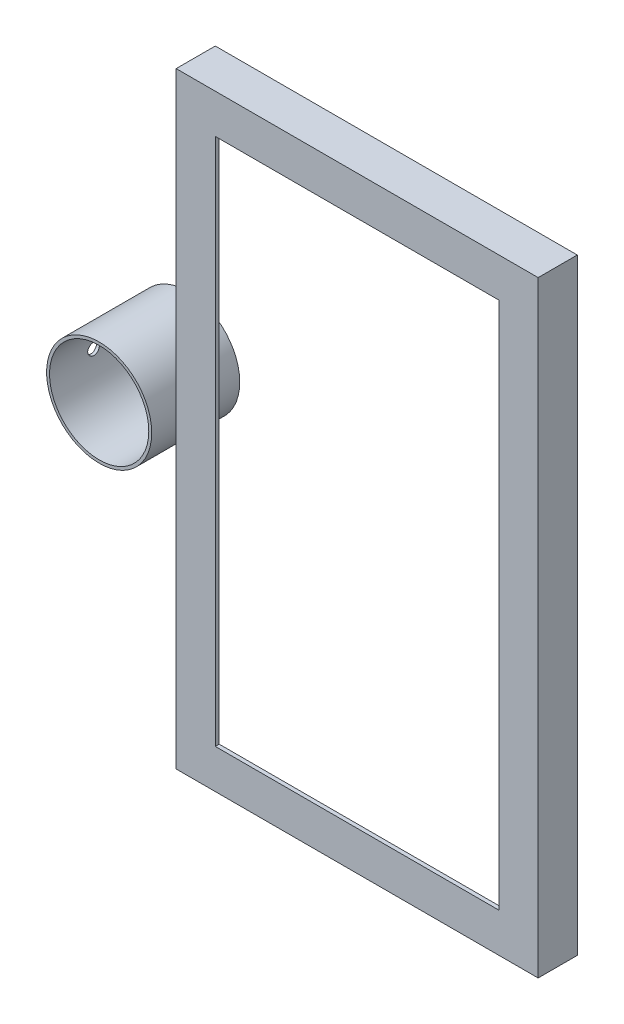
ISO-10303-21;
HEADER;
FILE_DESCRIPTION(('STEP AP214'),'2;1');
FILE_NAME('part.step','',(''),(''),'','','');
FILE_SCHEMA(('AUTOMOTIVE_DESIGN { 1 0 10303 214 1 1 1 1 }'));
ENDSEC;
DATA;
#1=APPLICATION_CONTEXT('core data for automotive mechanical design processes');
#2=APPLICATION_PROTOCOL_DEFINITION('international standard','automotive_design',2000,#1);
#3=PRODUCT_CONTEXT('',#1,'mechanical');
#4=PRODUCT('Part','Part','',(#3));
#5=PRODUCT_RELATED_PRODUCT_CATEGORY('part','',(#4));
#6=PRODUCT_DEFINITION_FORMATION('','',#4);
#7=PRODUCT_DEFINITION_CONTEXT('part definition',#1,'design');
#8=PRODUCT_DEFINITION('design','',#6,#7);
#9=PRODUCT_DEFINITION_SHAPE('','',#8);
#10=(LENGTH_UNIT() NAMED_UNIT(*) SI_UNIT(.MILLI.,.METRE.));
#11=(NAMED_UNIT(*) PLANE_ANGLE_UNIT() SI_UNIT($,.RADIAN.));
#12=(NAMED_UNIT(*) SI_UNIT($,.STERADIAN.) SOLID_ANGLE_UNIT());
#13=UNCERTAINTY_MEASURE_WITH_UNIT(LENGTH_MEASURE(1.E-05),#10,'distance_accuracy_value','');
#14=(GEOMETRIC_REPRESENTATION_CONTEXT(3) GLOBAL_UNCERTAINTY_ASSIGNED_CONTEXT((#13)) GLOBAL_UNIT_ASSIGNED_CONTEXT((#10,
#11,#12)) REPRESENTATION_CONTEXT('',''));
#15=CARTESIAN_POINT('',(0.,0.,0.));
#16=DIRECTION('',(0.,0.,1.));
#17=DIRECTION('',(1.,0.,0.));
#18=AXIS2_PLACEMENT_3D('',#15,#16,#17);
#19=CARTESIAN_POINT('',(0.,0.,32.5));
#20=DIRECTION('',(0.,0.,1.));
#21=DIRECTION('',(1.,0.,0.));
#22=AXIS2_PLACEMENT_3D('',#19,#20,#21);
#23=PLANE('',#22);
#24=DIRECTION('',(0.,-1.,0.));
#25=VECTOR('',#24,1.);
#26=CARTESIAN_POINT('',(26.85,155.,32.5));
#27=LINE('',#26,#25);
#28=CARTESIAN_POINT('',(26.85,155.,32.5));
#29=VERTEX_POINT('',#28);
#30=CARTESIAN_POINT('',(26.85,-155.,32.5));
#31=VERTEX_POINT('',#30);
#32=EDGE_CURVE('E198',#29,#31,#27,.T.);
#33=ORIENTED_EDGE('',*,*,#32,.T.);
#34=DIRECTION('',(1.,0.,0.));
#35=VECTOR('',#34,1.);
#36=CARTESIAN_POINT('',(26.85,-155.,32.5));
#37=LINE('',#36,#35);
#38=CARTESIAN_POINT('',(211.85,-155.,32.5));
#39=VERTEX_POINT('',#38);
#40=EDGE_CURVE('E201',#31,#39,#37,.T.);
#41=ORIENTED_EDGE('',*,*,#40,.T.);
#42=DIRECTION('',(0.,1.,0.));
#43=VECTOR('',#42,1.);
#44=CARTESIAN_POINT('',(211.85,155.,32.5));
#45=LINE('',#44,#43);
#46=CARTESIAN_POINT('',(211.85,155.,32.5));
#47=VERTEX_POINT('',#46);
#48=EDGE_CURVE('E204',#39,#47,#45,.T.);
#49=ORIENTED_EDGE('',*,*,#48,.T.);
#50=DIRECTION('',(-1.,0.,0.));
#51=VECTOR('',#50,1.);
#52=CARTESIAN_POINT('',(26.85,155.,32.5));
#53=LINE('',#52,#51);
#54=EDGE_CURVE('E206',#47,#29,#53,.T.);
#55=ORIENTED_EDGE('',*,*,#54,.T.);
#56=EDGE_LOOP('',(#33,#41,#49,#55));
#57=FACE_BOUND('',#56,.T.);
#58=DIRECTION('',(1.,0.,0.));
#59=VECTOR('',#58,1.);
#60=CARTESIAN_POINT('',(46.85,-135.,32.5));
#61=LINE('',#60,#59);
#62=CARTESIAN_POINT('',(46.85,-135.,32.5));
#63=VERTEX_POINT('',#62);
#64=CARTESIAN_POINT('',(191.85,-135.,32.5));
#65=VERTEX_POINT('',#64);
#66=EDGE_CURVE('E178',#63,#65,#61,.T.);
#67=ORIENTED_EDGE('',*,*,#66,.F.);
#68=DIRECTION('',(0.,-1.,0.));
#69=VECTOR('',#68,1.);
#70=CARTESIAN_POINT('',(46.85,135.,32.5));
#71=LINE('',#70,#69);
#72=CARTESIAN_POINT('',(46.85,135.,32.5));
#73=VERTEX_POINT('',#72);
#74=EDGE_CURVE('E158',#73,#63,#71,.T.);
#75=ORIENTED_EDGE('',*,*,#74,.F.);
#76=DIRECTION('',(-1.,0.,0.));
#77=VECTOR('',#76,1.);
#78=CARTESIAN_POINT('',(46.85,135.,32.5));
#79=LINE('',#78,#77);
#80=CARTESIAN_POINT('',(191.85,135.,32.5));
#81=VERTEX_POINT('',#80);
#82=EDGE_CURVE('E183',#81,#73,#79,.T.);
#83=ORIENTED_EDGE('',*,*,#82,.F.);
#84=DIRECTION('',(0.,1.,0.));
#85=VECTOR('',#84,1.);
#86=CARTESIAN_POINT('',(191.85,135.,32.5));
#87=LINE('',#86,#85);
#88=EDGE_CURVE('E180',#65,#81,#87,.T.);
#89=ORIENTED_EDGE('',*,*,#88,.F.);
#90=EDGE_LOOP('',(#67,#75,#83,#89));
#91=FACE_BOUND('',#90,.T.);
#92=ADVANCED_FACE('F43',(#57,#91),#23,.T.);
#93=CARTESIAN_POINT('',(0.,0.,12.5));
#94=DIRECTION('',(0.,0.,1.));
#95=DIRECTION('',(1.,0.,0.));
#96=AXIS2_PLACEMENT_3D('',#93,#94,#95);
#97=PLANE('',#96);
#98=DIRECTION('',(-1.,0.,0.));
#99=VECTOR('',#98,1.);
#100=CARTESIAN_POINT('',(26.85,153.,12.5));
#101=LINE('',#100,#99);
#102=CARTESIAN_POINT('',(209.85,153.,12.5));
#103=VERTEX_POINT('',#102);
#104=CARTESIAN_POINT('',(28.85,153.,12.5));
#105=VERTEX_POINT('',#104);
#106=EDGE_CURVE('E172',#103,#105,#101,.T.);
#107=ORIENTED_EDGE('',*,*,#106,.T.);
#108=DIRECTION('',(0.,-1.,0.));
#109=VECTOR('',#108,1.);
#110=CARTESIAN_POINT('',(28.85,155.,12.5));
#111=LINE('',#110,#109);
#112=CARTESIAN_POINT('',(28.85,-153.,12.5));
#113=VERTEX_POINT('',#112);
#114=EDGE_CURVE('E167',#105,#113,#111,.T.);
#115=ORIENTED_EDGE('',*,*,#114,.T.);
#116=DIRECTION('',(1.,0.,0.));
#117=VECTOR('',#116,1.);
#118=CARTESIAN_POINT('',(26.85,-153.,12.5));
#119=LINE('',#118,#117);
#120=CARTESIAN_POINT('',(209.85,-153.,12.5));
#121=VERTEX_POINT('',#120);
#122=EDGE_CURVE('E171',#113,#121,#119,.T.);
#123=ORIENTED_EDGE('',*,*,#122,.T.);
#124=DIRECTION('',(0.,1.,0.));
#125=VECTOR('',#124,1.);
#126=CARTESIAN_POINT('',(209.85,155.,12.5));
#127=LINE('',#126,#125);
#128=EDGE_CURVE('E58',#121,#103,#127,.T.);
#129=ORIENTED_EDGE('',*,*,#128,.T.);
#130=EDGE_LOOP('',(#107,#115,#123,#129));
#131=FACE_BOUND('',#130,.T.);
#132=DIRECTION('',(0.,-1.,0.));
#133=VECTOR('',#132,1.);
#134=CARTESIAN_POINT('',(26.85,155.,12.5));
#135=LINE('',#134,#133);
#136=CARTESIAN_POINT('',(26.85,155.,12.5));
#137=VERTEX_POINT('',#136);
#138=CARTESIAN_POINT('',(26.85,-155.,12.5));
#139=VERTEX_POINT('',#138);
#140=EDGE_CURVE('E197',#137,#139,#135,.T.);
#141=ORIENTED_EDGE('',*,*,#140,.F.);
#142=DIRECTION('',(-1.,0.,0.));
#143=VECTOR('',#142,1.);
#144=CARTESIAN_POINT('',(26.85,155.,12.5));
#145=LINE('',#144,#143);
#146=CARTESIAN_POINT('',(211.85,155.,12.5));
#147=VERTEX_POINT('',#146);
#148=EDGE_CURVE('E202',#147,#137,#145,.T.);
#149=ORIENTED_EDGE('',*,*,#148,.F.);
#150=DIRECTION('',(0.,1.,0.));
#151=VECTOR('',#150,1.);
#152=CARTESIAN_POINT('',(211.85,155.,12.5));
#153=LINE('',#152,#151);
#154=CARTESIAN_POINT('',(211.85,-155.,12.5));
#155=VERTEX_POINT('',#154);
#156=EDGE_CURVE('E213',#155,#147,#153,.T.);
#157=ORIENTED_EDGE('',*,*,#156,.F.);
#158=DIRECTION('',(1.,0.,0.));
#159=VECTOR('',#158,1.);
#160=CARTESIAN_POINT('',(26.85,-155.,12.5));
#161=LINE('',#160,#159);
#162=EDGE_CURVE('E211',#139,#155,#161,.T.);
#163=ORIENTED_EDGE('',*,*,#162,.F.);
#164=EDGE_LOOP('',(#141,#149,#157,#163));
#165=FACE_BOUND('',#164,.T.);
#166=ADVANCED_FACE('F231',(#131,#165),#97,.F.);
#167=CARTESIAN_POINT('',(26.85,155.,32.5));
#168=DIRECTION('',(1.,0.,0.));
#169=DIRECTION('',(0.,0.,-1.));
#170=AXIS2_PLACEMENT_3D('',#167,#168,#169);
#171=PLANE('',#170);
#172=ORIENTED_EDGE('',*,*,#140,.T.);
#173=DIRECTION('',(0.,0.,-1.));
#174=VECTOR('',#173,1.);
#175=CARTESIAN_POINT('',(26.85,-155.,32.5));
#176=LINE('',#175,#174);
#177=EDGE_CURVE('E12',#31,#139,#176,.T.);
#178=ORIENTED_EDGE('',*,*,#177,.F.);
#179=ORIENTED_EDGE('',*,*,#32,.F.);
#180=DIRECTION('',(0.,0.,-1.));
#181=VECTOR('',#180,1.);
#182=CARTESIAN_POINT('',(26.85,155.,32.5));
#183=LINE('',#182,#181);
#184=EDGE_CURVE('E208',#29,#137,#183,.T.);
#185=ORIENTED_EDGE('',*,*,#184,.T.);
#186=EDGE_LOOP('',(#172,#178,#179,#185));
#187=FACE_BOUND('',#186,.T.);
#188=ADVANCED_FACE('F45',(#187),#171,.F.);
#189=CARTESIAN_POINT('',(26.85,-155.,32.5));
#190=DIRECTION('',(0.,1.,0.));
#191=DIRECTION('',(0.,0.,1.));
#192=AXIS2_PLACEMENT_3D('',#189,#190,#191);
#193=PLANE('',#192);
#194=ORIENTED_EDGE('',*,*,#162,.T.);
#195=DIRECTION('',(0.,0.,-1.));
#196=VECTOR('',#195,1.);
#197=CARTESIAN_POINT('',(211.85,-155.,32.5));
#198=LINE('',#197,#196);
#199=EDGE_CURVE('E51',#39,#155,#198,.T.);
#200=ORIENTED_EDGE('',*,*,#199,.F.);
#201=ORIENTED_EDGE('',*,*,#40,.F.);
#202=ORIENTED_EDGE('',*,*,#177,.T.);
#203=EDGE_LOOP('',(#194,#200,#201,#202));
#204=FACE_BOUND('',#203,.T.);
#205=ADVANCED_FACE('F241',(#204),#193,.F.);
#206=CARTESIAN_POINT('',(211.85,155.,32.5));
#207=DIRECTION('',(-1.,0.,0.));
#208=DIRECTION('',(0.,-1.,0.));
#209=AXIS2_PLACEMENT_3D('',#206,#207,#208);
#210=PLANE('',#209);
#211=ORIENTED_EDGE('',*,*,#156,.T.);
#212=DIRECTION('',(0.,0.,-1.));
#213=VECTOR('',#212,1.);
#214=CARTESIAN_POINT('',(211.85,155.,32.5));
#215=LINE('',#214,#213);
#216=EDGE_CURVE('E218',#47,#147,#215,.T.);
#217=ORIENTED_EDGE('',*,*,#216,.F.);
#218=ORIENTED_EDGE('',*,*,#48,.F.);
#219=ORIENTED_EDGE('',*,*,#199,.T.);
#220=EDGE_LOOP('',(#211,#217,#218,#219));
#221=FACE_BOUND('',#220,.T.);
#222=ADVANCED_FACE('F225',(#221),#210,.F.);
#223=CARTESIAN_POINT('',(26.85,155.,32.5));
#224=DIRECTION('',(0.,-1.,0.));
#225=DIRECTION('',(1.,0.,0.));
#226=AXIS2_PLACEMENT_3D('',#223,#224,#225);
#227=PLANE('',#226);
#228=ORIENTED_EDGE('',*,*,#148,.T.);
#229=ORIENTED_EDGE('',*,*,#184,.F.);
#230=ORIENTED_EDGE('',*,*,#54,.F.);
#231=ORIENTED_EDGE('',*,*,#216,.T.);
#232=EDGE_LOOP('',(#228,#229,#230,#231));
#233=FACE_BOUND('',#232,.T.);
#234=ADVANCED_FACE('F234',(#233),#227,.F.);
#235=CARTESIAN_POINT('',(46.85,135.,32.5));
#236=DIRECTION('',(1.,0.,0.));
#237=DIRECTION('',(0.,1.,0.));
#238=AXIS2_PLACEMENT_3D('',#235,#236,#237);
#239=PLANE('',#238);
#240=DIRECTION('',(0.,-1.,0.));
#241=VECTOR('',#240,1.);
#242=CARTESIAN_POINT('',(46.85,135.,30.5));
#243=LINE('',#242,#241);
#244=CARTESIAN_POINT('',(46.85,135.,30.5));
#245=VERTEX_POINT('',#244);
#246=CARTESIAN_POINT('',(46.85,-135.,30.5));
#247=VERTEX_POINT('',#246);
#248=EDGE_CURVE('E163',#245,#247,#243,.T.);
#249=ORIENTED_EDGE('',*,*,#248,.F.);
#250=DIRECTION('',(0.,0.,-1.));
#251=VECTOR('',#250,1.);
#252=CARTESIAN_POINT('',(46.85,135.,32.5));
#253=LINE('',#252,#251);
#254=EDGE_CURVE('E185',#73,#245,#253,.T.);
#255=ORIENTED_EDGE('',*,*,#254,.F.);
#256=ORIENTED_EDGE('',*,*,#74,.T.);
#257=DIRECTION('',(0.,0.,-1.));
#258=VECTOR('',#257,1.);
#259=CARTESIAN_POINT('',(46.85,-135.,32.5));
#260=LINE('',#259,#258);
#261=EDGE_CURVE('E194',#63,#247,#260,.T.);
#262=ORIENTED_EDGE('',*,*,#261,.T.);
#263=EDGE_LOOP('',(#249,#255,#256,#262));
#264=FACE_BOUND('',#263,.T.);
#265=ADVANCED_FACE('F256',(#264),#239,.T.);
#266=CARTESIAN_POINT('',(46.85,-135.,32.5));
#267=DIRECTION('',(0.,1.,0.));
#268=DIRECTION('',(0.,0.,1.));
#269=AXIS2_PLACEMENT_3D('',#266,#267,#268);
#270=PLANE('',#269);
#271=DIRECTION('',(1.,0.,0.));
#272=VECTOR('',#271,1.);
#273=CARTESIAN_POINT('',(46.85,-135.,30.5));
#274=LINE('',#273,#272);
#275=CARTESIAN_POINT('',(191.85,-135.,30.5));
#276=VERTEX_POINT('',#275);
#277=EDGE_CURVE('E161',#247,#276,#274,.T.);
#278=ORIENTED_EDGE('',*,*,#277,.F.);
#279=ORIENTED_EDGE('',*,*,#261,.F.);
#280=ORIENTED_EDGE('',*,*,#66,.T.);
#281=DIRECTION('',(0.,0.,-1.));
#282=VECTOR('',#281,1.);
#283=CARTESIAN_POINT('',(191.85,-135.,32.5));
#284=LINE('',#283,#282);
#285=EDGE_CURVE('E191',#65,#276,#284,.T.);
#286=ORIENTED_EDGE('',*,*,#285,.T.);
#287=EDGE_LOOP('',(#278,#279,#280,#286));
#288=FACE_BOUND('',#287,.T.);
#289=ADVANCED_FACE('F263',(#288),#270,.T.);
#290=CARTESIAN_POINT('',(191.85,135.,32.5));
#291=DIRECTION('',(-1.,0.,0.));
#292=DIRECTION('',(0.,0.,1.));
#293=AXIS2_PLACEMENT_3D('',#290,#291,#292);
#294=PLANE('',#293);
#295=DIRECTION('',(0.,1.,0.));
#296=VECTOR('',#295,1.);
#297=CARTESIAN_POINT('',(191.85,135.,30.5));
#298=LINE('',#297,#296);
#299=CARTESIAN_POINT('',(191.85,135.,30.5));
#300=VERTEX_POINT('',#299);
#301=EDGE_CURVE('E66',#276,#300,#298,.T.);
#302=ORIENTED_EDGE('',*,*,#301,.F.);
#303=ORIENTED_EDGE('',*,*,#285,.F.);
#304=ORIENTED_EDGE('',*,*,#88,.T.);
#305=DIRECTION('',(0.,0.,-1.));
#306=VECTOR('',#305,1.);
#307=CARTESIAN_POINT('',(191.85,135.,32.5));
#308=LINE('',#307,#306);
#309=EDGE_CURVE('E188',#81,#300,#308,.T.);
#310=ORIENTED_EDGE('',*,*,#309,.T.);
#311=EDGE_LOOP('',(#302,#303,#304,#310));
#312=FACE_BOUND('',#311,.T.);
#313=ADVANCED_FACE('F268',(#312),#294,.T.);
#314=CARTESIAN_POINT('',(46.85,135.,32.5));
#315=DIRECTION('',(0.,-1.,0.));
#316=DIRECTION('',(0.,0.,-1.));
#317=AXIS2_PLACEMENT_3D('',#314,#315,#316);
#318=PLANE('',#317);
#319=DIRECTION('',(-1.,0.,0.));
#320=VECTOR('',#319,1.);
#321=CARTESIAN_POINT('',(46.85,135.,30.5));
#322=LINE('',#321,#320);
#323=EDGE_CURVE('E165',#300,#245,#322,.T.);
#324=ORIENTED_EDGE('',*,*,#323,.F.);
#325=ORIENTED_EDGE('',*,*,#309,.F.);
#326=ORIENTED_EDGE('',*,*,#82,.T.);
#327=ORIENTED_EDGE('',*,*,#254,.T.);
#328=EDGE_LOOP('',(#324,#325,#326,#327));
#329=FACE_BOUND('',#328,.T.);
#330=ADVANCED_FACE('F276',(#329),#318,.T.);
#331=CARTESIAN_POINT('',(0.,0.,30.5));
#332=DIRECTION('',(0.,0.,1.));
#333=DIRECTION('',(1.,0.,0.));
#334=AXIS2_PLACEMENT_3D('',#331,#332,#333);
#335=PLANE('',#334);
#336=DIRECTION('',(0.,-1.,0.));
#337=VECTOR('',#336,1.);
#338=CARTESIAN_POINT('',(28.85,155.,30.5));
#339=LINE('',#338,#337);
#340=CARTESIAN_POINT('',(28.85,153.,30.5));
#341=VERTEX_POINT('',#340);
#342=CARTESIAN_POINT('',(28.85,-153.,30.5));
#343=VERTEX_POINT('',#342);
#344=EDGE_CURVE('E143',#341,#343,#339,.T.);
#345=ORIENTED_EDGE('',*,*,#344,.F.);
#346=DIRECTION('',(-1.,0.,0.));
#347=VECTOR('',#346,1.);
#348=CARTESIAN_POINT('',(26.85,153.,30.5));
#349=LINE('',#348,#347);
#350=CARTESIAN_POINT('',(209.85,153.,30.5));
#351=VERTEX_POINT('',#350);
#352=EDGE_CURVE('E151',#351,#341,#349,.T.);
#353=ORIENTED_EDGE('',*,*,#352,.F.);
#354=DIRECTION('',(0.,1.,0.));
#355=VECTOR('',#354,1.);
#356=CARTESIAN_POINT('',(209.85,155.,30.5));
#357=LINE('',#356,#355);
#358=CARTESIAN_POINT('',(209.85,-153.,30.5));
#359=VERTEX_POINT('',#358);
#360=EDGE_CURVE('E142',#359,#351,#357,.T.);
#361=ORIENTED_EDGE('',*,*,#360,.F.);
#362=DIRECTION('',(1.,0.,0.));
#363=VECTOR('',#362,1.);
#364=CARTESIAN_POINT('',(26.85,-153.,30.5));
#365=LINE('',#364,#363);
#366=EDGE_CURVE('E132',#343,#359,#365,.T.);
#367=ORIENTED_EDGE('',*,*,#366,.F.);
#368=EDGE_LOOP('',(#345,#353,#361,#367));
#369=FACE_BOUND('',#368,.T.);
#370=ORIENTED_EDGE('',*,*,#277,.T.);
#371=ORIENTED_EDGE('',*,*,#301,.T.);
#372=ORIENTED_EDGE('',*,*,#323,.T.);
#373=ORIENTED_EDGE('',*,*,#248,.T.);
#374=EDGE_LOOP('',(#370,#371,#372,#373));
#375=FACE_BOUND('',#374,.T.);
#376=ADVANCED_FACE('F150',(#369,#375),#335,.F.);
#377=CARTESIAN_POINT('',(28.85,155.,32.5));
#378=DIRECTION('',(1.,0.,0.));
#379=DIRECTION('',(0.,0.,-1.));
#380=AXIS2_PLACEMENT_3D('',#377,#378,#379);
#381=PLANE('',#380);
#382=ORIENTED_EDGE('',*,*,#114,.F.);
#383=DIRECTION('',(0.,0.,-1.));
#384=VECTOR('',#383,1.);
#385=CARTESIAN_POINT('',(28.85,153.,32.5));
#386=LINE('',#385,#384);
#387=EDGE_CURVE('E153',#341,#105,#386,.T.);
#388=ORIENTED_EDGE('',*,*,#387,.F.);
#389=ORIENTED_EDGE('',*,*,#344,.T.);
#390=DIRECTION('',(0.,0.,-1.));
#391=VECTOR('',#390,1.);
#392=CARTESIAN_POINT('',(28.85,-153.,32.5));
#393=LINE('',#392,#391);
#394=EDGE_CURVE('E137',#343,#113,#393,.T.);
#395=ORIENTED_EDGE('',*,*,#394,.T.);
#396=EDGE_LOOP('',(#382,#388,#389,#395));
#397=FACE_BOUND('',#396,.T.);
#398=ADVANCED_FACE('F297',(#397),#381,.T.);
#399=CARTESIAN_POINT('',(26.85,-153.,32.5));
#400=DIRECTION('',(0.,1.,0.));
#401=DIRECTION('',(0.,0.,1.));
#402=AXIS2_PLACEMENT_3D('',#399,#400,#401);
#403=PLANE('',#402);
#404=ORIENTED_EDGE('',*,*,#122,.F.);
#405=ORIENTED_EDGE('',*,*,#394,.F.);
#406=ORIENTED_EDGE('',*,*,#366,.T.);
#407=DIRECTION('',(0.,0.,-1.));
#408=VECTOR('',#407,1.);
#409=CARTESIAN_POINT('',(209.85,-153.,32.5));
#410=LINE('',#409,#408);
#411=EDGE_CURVE('E134',#359,#121,#410,.T.);
#412=ORIENTED_EDGE('',*,*,#411,.T.);
#413=EDGE_LOOP('',(#404,#405,#406,#412));
#414=FACE_BOUND('',#413,.T.);
#415=ADVANCED_FACE('F133',(#414),#403,.T.);
#416=CARTESIAN_POINT('',(209.85,155.,32.5));
#417=DIRECTION('',(-1.,0.,0.));
#418=DIRECTION('',(0.,-1.,0.));
#419=AXIS2_PLACEMENT_3D('',#416,#417,#418);
#420=PLANE('',#419);
#421=ORIENTED_EDGE('',*,*,#128,.F.);
#422=ORIENTED_EDGE('',*,*,#411,.F.);
#423=ORIENTED_EDGE('',*,*,#360,.T.);
#424=DIRECTION('',(0.,0.,-1.));
#425=VECTOR('',#424,1.);
#426=CARTESIAN_POINT('',(209.85,153.,32.5));
#427=LINE('',#426,#425);
#428=EDGE_CURVE('E147',#351,#103,#427,.T.);
#429=ORIENTED_EDGE('',*,*,#428,.T.);
#430=EDGE_LOOP('',(#421,#422,#423,#429));
#431=FACE_BOUND('',#430,.T.);
#432=ADVANCED_FACE('F145',(#431),#420,.T.);
#433=CARTESIAN_POINT('',(26.85,153.,32.5));
#434=DIRECTION('',(0.,-1.,0.));
#435=DIRECTION('',(1.,0.,0.));
#436=AXIS2_PLACEMENT_3D('',#433,#434,#435);
#437=PLANE('',#436);
#438=ORIENTED_EDGE('',*,*,#106,.F.);
#439=ORIENTED_EDGE('',*,*,#428,.F.);
#440=ORIENTED_EDGE('',*,*,#352,.T.);
#441=ORIENTED_EDGE('',*,*,#387,.T.);
#442=EDGE_LOOP('',(#438,#439,#440,#441));
#443=FACE_BOUND('',#442,.T.);
#444=ADVANCED_FACE('F289',(#443),#437,.T.);
#445=CLOSED_SHELL('',(#92,#166,#188,#205,#222,#234,#265,#289,#313,#330,#376,#398,#415,#432,#444));
#446=MANIFOLD_SOLID_BREP('B2',#445);
#447=CARTESIAN_POINT('',(0.,0.,45.));
#448=DIRECTION('',(0.,0.,1.));
#449=DIRECTION('',(1.,0.,0.));
#450=AXIS2_PLACEMENT_3D('',#447,#448,#449);
#451=PLANE('',#450);
#452=CARTESIAN_POINT('',(0.,0.,45.));
#453=DIRECTION('',(0.,0.,1.));
#454=DIRECTION('',(1.,0.,0.));
#455=AXIS2_PLACEMENT_3D('',#452,#453,#454);
#456=CIRCLE('',#455,26.85);
#457=CARTESIAN_POINT('',(26.85,0.,45.));
#458=VERTEX_POINT('',#457);
#459=EDGE_CURVE('E42',#458,#458,#456,.T.);
#460=ORIENTED_EDGE('',*,*,#459,.T.);
#461=EDGE_LOOP('',(#460));
#462=FACE_BOUND('',#461,.T.);
#463=CARTESIAN_POINT('',(0.,0.,45.));
#464=DIRECTION('',(0.,0.,1.));
#465=DIRECTION('',(1.,0.,0.));
#466=AXIS2_PLACEMENT_3D('',#463,#464,#465);
#467=CIRCLE('',#466,25.35);
#468=CARTESIAN_POINT('',(25.35,0.,45.));
#469=VERTEX_POINT('',#468);
#470=EDGE_CURVE('E399',#469,#469,#467,.T.);
#471=ORIENTED_EDGE('',*,*,#470,.F.);
#472=EDGE_LOOP('',(#471));
#473=FACE_BOUND('',#472,.T.);
#474=ADVANCED_FACE('F387',(#462,#473),#451,.T.);
#475=CARTESIAN_POINT('',(0.,0.,0.));
#476=DIRECTION('',(0.,0.,1.));
#477=DIRECTION('',(1.,0.,0.));
#478=AXIS2_PLACEMENT_3D('',#475,#476,#477);
#479=PLANE('',#478);
#480=CARTESIAN_POINT('',(0.,0.,0.));
#481=DIRECTION('',(0.,0.,1.));
#482=DIRECTION('',(1.,0.,0.));
#483=AXIS2_PLACEMENT_3D('',#480,#481,#482);
#484=CIRCLE('',#483,26.85);
#485=CARTESIAN_POINT('',(26.85,0.,0.));
#486=VERTEX_POINT('',#485);
#487=EDGE_CURVE('E392',#486,#486,#484,.T.);
#488=ORIENTED_EDGE('',*,*,#487,.F.);
#489=EDGE_LOOP('',(#488));
#490=FACE_BOUND('',#489,.T.);
#491=CARTESIAN_POINT('',(0.,0.,0.));
#492=DIRECTION('',(0.,0.,1.));
#493=DIRECTION('',(1.,0.,0.));
#494=AXIS2_PLACEMENT_3D('',#491,#492,#493);
#495=CIRCLE('',#494,25.35);
#496=CARTESIAN_POINT('',(25.35,0.,0.));
#497=VERTEX_POINT('',#496);
#498=EDGE_CURVE('E401',#497,#497,#495,.T.);
#499=ORIENTED_EDGE('',*,*,#498,.T.);
#500=EDGE_LOOP('',(#499));
#501=FACE_BOUND('',#500,.T.);
#502=ADVANCED_FACE('F428',(#490,#501),#479,.F.);
#503=CARTESIAN_POINT('',(0.,0.,45.));
#504=DIRECTION('',(0.,0.,-1.));
#505=DIRECTION('',(-1.,0.,0.));
#506=AXIS2_PLACEMENT_3D('',#503,#504,#505);
#507=CYLINDRICAL_SURFACE('',#506,26.85);
#508=CARTESIAN_POINT('',(-26.85,0.,25.5));
#509=CARTESIAN_POINT('',(-26.8499978681371,-0.167949755879179,25.4999927843618));
#510=CARTESIAN_POINT('',(-26.8484074836248,-0.336007865428916,25.4858489242209));
#511=CARTESIAN_POINT('',(-26.8422160736334,-0.667457230759244,25.4296441148908));
#512=CARTESIAN_POINT('',(-26.8376118078519,-0.830843265926559,25.3875531183067));
#513=CARTESIAN_POINT('',(-26.8259119137233,-1.14810134859816,25.2767013107621));
#514=CARTESIAN_POINT('',(-26.8188178667828,-1.30197936241676,25.2079574257276));
#515=CARTESIAN_POINT('',(-26.802929772429,-1.59598200821511,25.0457859914104));
#516=CARTESIAN_POINT('',(-26.7941360425381,-1.73610920166441,24.9523630512986));
#517=CARTESIAN_POINT('',(-26.7757885206059,-1.99928673524659,24.7430408314506));
#518=CARTESIAN_POINT('',(-26.766231857464,-2.12226727590385,24.6270540370622));
#519=CARTESIAN_POINT('',(-26.7474590396756,-2.34706003334416,24.3760839074701));
#520=CARTESIAN_POINT('',(-26.7382429014825,-2.44887122837004,24.2410996558642));
#521=CARTESIAN_POINT('',(-26.7211658681812,-2.62868864044265,23.9555213681453));
#522=CARTESIAN_POINT('',(-26.7133086541329,-2.70663062683485,23.8048866494865));
#523=CARTESIAN_POINT('',(-26.6998758732398,-2.83608699898821,23.4925643990722));
#524=CARTESIAN_POINT('',(-26.6943002367989,-2.88760219087077,23.3308772046313));
#525=CARTESIAN_POINT('',(-26.6860886313822,-2.96253320769671,23.0017578996744));
#526=CARTESIAN_POINT('',(-26.6834404448325,-2.98606584787894,22.8343526946672));
#527=CARTESIAN_POINT('',(-26.6813459300937,-3.00472501949253,22.4979495525859));
#528=CARTESIAN_POINT('',(-26.681899498099,-2.9998524718609,22.3289516673261));
#529=CARTESIAN_POINT('',(-26.6861347740419,-2.9619356849775,21.9949695338968));
#530=CARTESIAN_POINT('',(-26.6898022641559,-2.92901948758901,21.829970543446));
#531=CARTESIAN_POINT('',(-26.6998299648133,-2.83614924350035,21.5078533220494));
#532=CARTESIAN_POINT('',(-26.7061902198183,-2.77619475035572,21.3507352212771));
#533=CARTESIAN_POINT('',(-26.720903078613,-2.63081011255247,21.0484382649644));
#534=CARTESIAN_POINT('',(-26.7292600764661,-2.54532367668652,20.9032867042991));
#535=CARTESIAN_POINT('',(-26.7470212420382,-2.35134216502749,20.6293420097336));
#536=CARTESIAN_POINT('',(-26.7564254480388,-2.24284624797166,20.5005494742204));
#537=CARTESIAN_POINT('',(-26.7752847222848,-2.00521287333374,20.2622351025052));
#538=CARTESIAN_POINT('',(-26.7847397851456,-1.87596492954625,20.1528234061719));
#539=CARTESIAN_POINT('',(-26.8025866936327,-1.60087859138917,19.9572318977266));
#540=CARTESIAN_POINT('',(-26.8109785375705,-1.45504017067386,19.8710521225077));
#541=CARTESIAN_POINT('',(-26.8257572620422,-1.15083257194363,19.7243732179809));
#542=CARTESIAN_POINT('',(-26.8321436610896,-0.992460396113296,19.6638802545849));
#543=CARTESIAN_POINT('',(-26.8421872891407,-0.667719428622168,19.5703758255271));
#544=CARTESIAN_POINT('',(-26.8458446201117,-0.501350935977627,19.5373633330981));
#545=CARTESIAN_POINT('',(-26.8500048688161,-0.166293074338156,19.499898010416));
#546=CARTESIAN_POINT('',(-26.8505245600648,0.00237911333976669,19.4952933119817));
#547=CARTESIAN_POINT('',(-26.8483960892895,0.338092756912265,19.5143745682111));
#548=CARTESIAN_POINT('',(-26.8457479809122,0.505134240374441,19.538060043782));
#549=CARTESIAN_POINT('',(-26.8375920471284,0.832402123868033,19.6129232306042));
#550=CARTESIAN_POINT('',(-26.8320916796565,0.992645123784394,19.6640292560977));
#551=CARTESIAN_POINT('',(-26.8188477034796,1.30228479109488,19.7922087823906));
#552=CARTESIAN_POINT('',(-26.8111040328299,1.45168115883625,19.8692830002645));
#553=CARTESIAN_POINT('',(-26.7941964985011,1.73606969961913,20.0475836205756));
#554=CARTESIAN_POINT('',(-26.7850268631097,1.87099939215037,20.1489091227165));
#555=CARTESIAN_POINT('',(-26.7663132827261,2.12199054047601,20.3726948030121));
#556=CARTESIAN_POINT('',(-26.7567693259554,2.23805140194363,20.4951556466335));
#557=CARTESIAN_POINT('',(-26.7383317172725,2.44854276608089,20.7584012847076));
#558=CARTESIAN_POINT('',(-26.7294411990386,2.54287314949787,20.8992663854465));
#559=CARTESIAN_POINT('',(-26.7133665724119,2.70653610629872,21.1949286546146));
#560=CARTESIAN_POINT('',(-26.7061824357646,2.77586909360311,21.3497255922998));
#561=CARTESIAN_POINT('',(-26.6943544358408,2.88740396558858,21.6685230626221));
#562=CARTESIAN_POINT('',(-26.6897051278062,2.92966403679062,21.8325030275558));
#563=CARTESIAN_POINT('',(-26.6834569113332,2.98604166910612,22.165286415032));
#564=CARTESIAN_POINT('',(-26.6818578915734,3.00016025725533,22.3340896613187));
#565=CARTESIAN_POINT('',(-26.681894060689,2.99983787611794,22.6707324424441));
#566=CARTESIAN_POINT('',(-26.6835114393766,2.98555417906994,22.8385721517664));
#567=CARTESIAN_POINT('',(-26.6897600558318,2.92916389908226,23.1694506932045));
#568=CARTESIAN_POINT('',(-26.6943912957677,2.88705729612712,23.3324895218667));
#569=CARTESIAN_POINT('',(-26.7061406228053,2.77626247443586,23.6491282962456));
#570=CARTESIAN_POINT('',(-26.7132581532188,2.70758020570558,23.802730345842));
#571=CARTESIAN_POINT('',(-26.7291791390674,2.54559943167599,24.096252872014));
#572=CARTESIAN_POINT('',(-26.7379825986838,2.45230086532616,24.2361733146569));
#573=CARTESIAN_POINT('',(-26.7563419673243,2.24314791072125,24.4991662406379));
#574=CARTESIAN_POINT('',(-26.7659016289198,2.12717620862917,24.6221451689411));
#575=CARTESIAN_POINT('',(-26.7846624244576,1.87620855298306,24.8469610560564));
#576=CARTESIAN_POINT('',(-26.7938634726149,1.74120808272696,24.9487929811439));
#577=CARTESIAN_POINT('',(-26.8109006971534,1.45554939976491,25.1286809901045));
#578=CARTESIAN_POINT('',(-26.8187325917035,1.30484433845702,25.2066630373147));
#579=CARTESIAN_POINT('',(-26.8321042419758,0.992481775919697,25.3361063812119));
#580=CARTESIAN_POINT('',(-26.8376465394733,0.830836653066003,25.387597102677));
#581=CARTESIAN_POINT('',(-26.8444467801225,0.556925104769897,25.449982703758));
#582=CARTESIAN_POINT('',(-26.8465193362429,0.446399796710794,25.4687129814661));
#583=CARTESIAN_POINT('',(-26.8492966532138,0.223932379814003,25.4937240012716));
#584=CARTESIAN_POINT('',(-26.8500014215437,0.111990278727173,25.5000048114469));
#585=CARTESIAN_POINT('',(-26.85,0.,25.5));
#586=B_SPLINE_CURVE_WITH_KNOTS('',3,(#508,#509,#510,#511,#512,#513,#514,#515,#516,#517,#518,
#519,#520,#521,#522,#523,#524,#525,#526,#527,#528,#529,#530,#531,#532,#533,#534,#535,#536,#537,
#538,#539,#540,#541,#542,#543,#544,#545,#546,#547,#548,#549,#550,#551,#552,#553,#554,#555,#556,
#557,#558,#559,#560,#561,#562,#563,#564,#565,#566,#567,#568,#569,#570,#571,#572,#573,#574,#575,
#576,#577,#578,#579,#580,#581,#582,#583,#584,#585),.UNSPECIFIED.,.T.,.F.,(4,2,2,2,2,2,2,2,2,2,2,
2,2,2,2,2,2,2,2,2,2,2,2,2,2,2,2,2,2,2,2,2,2,2,2,2,2,2,4),(0.,0.503440269781957,1.00742269230561,
1.51108558346869,2.01465447471798,2.52021688180349,3.02580368464389,3.53273927385056,
4.03965939860397,4.54445583405847,5.04923590337792,5.55172352065999,6.05421943510039,
6.5578315032218,7.06146198736617,7.56786864778709,8.07427611239433,8.58080506740415,
9.08731509585853,9.59111495647251,10.094906285381,10.5973869207292,11.0998814325003,
11.6044654757519,12.1090654092159,12.6159456640543,13.1228175253072,13.6285963035884,
14.1343566229135,14.6373241894307,15.1402921177772,15.6431475021092,16.1460041335773,
16.6515349697739,17.1571860023655,17.6643911465608,18.1710316985781,18.506731647348,
18.8424297603951),.UNSPECIFIED.);
#587=CARTESIAN_POINT('',(-26.85,0.,25.5));
#588=VERTEX_POINT('',#587);
#589=EDGE_CURVE('E404',#588,#588,#586,.T.);
#590=ORIENTED_EDGE('',*,*,#589,.T.);
#591=EDGE_LOOP('',(#590));
#592=FACE_BOUND('',#591,.T.);
#593=ORIENTED_EDGE('',*,*,#459,.F.);
#594=EDGE_LOOP('',(#593));
#595=FACE_BOUND('',#594,.T.);
#596=ORIENTED_EDGE('',*,*,#487,.T.);
#597=EDGE_LOOP('',(#596));
#598=FACE_BOUND('',#597,.T.);
#599=ADVANCED_FACE('F389',(#592,#595,#598),#507,.T.);
#600=CARTESIAN_POINT('',(0.,0.,45.));
#601=DIRECTION('',(0.,0.,-1.));
#602=DIRECTION('',(-1.,0.,0.));
#603=AXIS2_PLACEMENT_3D('',#600,#601,#602);
#604=CYLINDRICAL_SURFACE('',#603,25.35);
#605=CARTESIAN_POINT('',(-25.35,0.,25.5));
#606=CARTESIAN_POINT('',(-25.3499977617838,0.167881701463696,25.499992825129));
#607=CARTESIAN_POINT('',(-25.3483146478358,0.335870065324136,25.4858603721132));
#608=CARTESIAN_POINT('',(-25.3417622540562,0.667177213202571,25.429703527444));
#609=CARTESIAN_POINT('',(-25.3368895946134,0.830490852134282,25.3876495497383));
#610=CARTESIAN_POINT('',(-25.3245073594936,1.14760385284884,25.2769017443501));
#611=CARTESIAN_POINT('',(-25.3169995068643,1.30140935452101,25.2082253209642));
#612=CARTESIAN_POINT('',(-25.3001831974516,1.59528100990889,25.0462189818499));
#613=CARTESIAN_POINT('',(-25.2908750636955,1.73534962167122,24.9528934878459));
#614=CARTESIAN_POINT('',(-25.2714468224602,1.9984963954726,24.7437430165949));
#615=CARTESIAN_POINT('',(-25.2613233063164,2.12149668361446,24.6278203677049));
#616=CARTESIAN_POINT('',(-25.2414329655929,2.34634496209645,24.3769756357147));
#617=CARTESIAN_POINT('',(-25.2316661587093,2.44819190421306,24.2420526116341));
#618=CARTESIAN_POINT('',(-25.2135612476123,2.628128828808,23.9565358363966));
#619=CARTESIAN_POINT('',(-25.2052275248967,2.70614650109484,23.8058962125464));
#620=CARTESIAN_POINT('',(-25.1909766958282,2.83574849773068,23.4935384619248));
#621=CARTESIAN_POINT('',(-25.185059507111,2.88733372300859,23.3318207129555));
#622=CARTESIAN_POINT('',(-25.1763438733378,2.96237135013672,23.002702118957));
#623=CARTESIAN_POINT('',(-25.1735309188817,2.98595467441214,22.8353315145385));
#624=CARTESIAN_POINT('',(-25.1712976972751,3.00472405755883,22.49898619431));
#625=CARTESIAN_POINT('',(-25.1718773073444,2.99991114411852,22.3300115367732));
#626=CARTESIAN_POINT('',(-25.1763504519024,2.96213226552515,21.9961642276331));
#627=CARTESIAN_POINT('',(-25.1802270534757,2.92931014905087,21.8312750387804));
#628=CARTESIAN_POINT('',(-25.1908309708921,2.83666882668616,21.5093616943558));
#629=CARTESIAN_POINT('',(-25.1975583390003,2.77684912582924,21.3523376830406));
#630=CARTESIAN_POINT('',(-25.2131250776567,2.63175488675195,21.0501629785998));
#631=CARTESIAN_POINT('',(-25.2219696550279,2.54641746217872,20.9050427605711));
#632=CARTESIAN_POINT('',(-25.2407701330311,2.35275523359717,20.6311288809266));
#633=CARTESIAN_POINT('',(-25.2507260792348,2.24442948679132,20.5023358892695));
#634=CARTESIAN_POINT('',(-25.2707028525977,2.00706658048317,20.2638972005499));
#635=CARTESIAN_POINT('',(-25.2807236998751,1.87790536070521,20.1543749678507));
#636=CARTESIAN_POINT('',(-25.2996433784877,1.60296611495444,19.9585467874368));
#637=CARTESIAN_POINT('',(-25.3085422076709,1.45718805711404,19.8722408842472));
#638=CARTESIAN_POINT('',(-25.3242199217504,1.15306080681838,19.7252966337241));
#639=CARTESIAN_POINT('',(-25.3309982028785,0.994708050122883,19.6646655948729));
#640=CARTESIAN_POINT('',(-25.3416654561049,0.669971411260076,19.5708880057682));
#641=CARTESIAN_POINT('',(-25.3455545493718,0.503587866204357,19.5377403028958));
#642=CARTESIAN_POINT('',(-25.3499895400434,0.168580676812783,19.500029370534));
#643=CARTESIAN_POINT('',(-25.3505553388786,-2.35599109634692E-05,19.4952959791841));
#644=CARTESIAN_POINT('',(-25.3483336181245,-0.335622869463235,19.5140995876655));
#645=CARTESIAN_POINT('',(-25.345546162391,-0.502617972873297,19.5376360491565));
#646=CARTESIAN_POINT('',(-25.3369436134108,-0.829759696538515,19.6121699389084));
#647=CARTESIAN_POINT('',(-25.3311374209315,-0.989924960511721,19.6630866513517));
#648=CARTESIAN_POINT('',(-25.317147799314,-1.29944269363859,19.790852066597));
#649=CARTESIAN_POINT('',(-25.3089642971565,-1.4487948304907,19.8677015659368));
#650=CARTESIAN_POINT('',(-25.2910836242065,-1.73320942116155,20.0455657354041));
#651=CARTESIAN_POINT('',(-25.2813796001945,-1.86820229010636,20.146690975003));
#652=CARTESIAN_POINT('',(-25.2615660131402,-2.11935946418483,20.3700790224377));
#653=CARTESIAN_POINT('',(-25.2514564357338,-2.23552310167877,20.4923425794704));
#654=CARTESIAN_POINT('',(-25.2319101780826,-2.44632439185234,20.7552842035812));
#655=CARTESIAN_POINT('',(-25.222477181511,-2.54084956409224,20.8960527600059));
#656=CARTESIAN_POINT('',(-25.2054114995078,-2.70491474680515,21.1915673206541));
#657=CARTESIAN_POINT('',(-25.1977787811852,-2.77445521375992,21.3463130694435));
#658=CARTESIAN_POINT('',(-25.1852024365588,-2.88639309047267,21.6650198784136));
#659=CARTESIAN_POINT('',(-25.1802524320576,-2.92885492302779,21.8289580493424));
#660=CARTESIAN_POINT('',(-25.1735832898311,-2.98563813635891,22.1616996644726));
#661=CARTESIAN_POINT('',(-25.1718640185773,-2.9999606801534,22.3305029073042));
#662=CARTESIAN_POINT('',(-25.1718546051893,-3.00003891642537,22.6670642898131));
#663=CARTESIAN_POINT('',(-25.1735432525231,-2.98597130628168,22.8348224154025));
#664=CARTESIAN_POINT('',(-25.1801139176557,-2.93004167836228,23.1655726893078));
#665=CARTESIAN_POINT('',(-25.1849959368485,-2.88817964845262,23.328564835543));
#666=CARTESIAN_POINT('',(-25.1973969026061,-2.77790292983182,23.6451393513489));
#667=CARTESIAN_POINT('',(-25.204915096654,-2.70949581803125,23.7987243915713));
#668=CARTESIAN_POINT('',(-25.2217426318,-2.54808826393666,24.0922632633777));
#669=CARTESIAN_POINT('',(-25.2310519860998,-2.45508764037693,24.2322169944823));
#670=CARTESIAN_POINT('',(-25.2504823743802,-2.24647472061154,24.4954246693604));
#671=CARTESIAN_POINT('',(-25.2606079255241,-2.13073064822477,24.6185738426319));
#672=CARTESIAN_POINT('',(-25.2804894693067,-1.88018871156219,24.8437714924087));
#673=CARTESIAN_POINT('',(-25.2902453738786,-1.74538634246519,24.9458149660611));
#674=CARTESIAN_POINT('',(-25.3083247951051,-1.4600304769363,25.1261968057688));
#675=CARTESIAN_POINT('',(-25.3166432945129,-1.30942464511499,25.2044528356612));
#676=CARTESIAN_POINT('',(-25.3308590088287,-0.997198570819786,25.3344540457502));
#677=CARTESIAN_POINT('',(-25.3367588819007,-0.835590649172976,25.3862283459853));
#678=CARTESIAN_POINT('',(-25.3440329195877,-0.560935911859739,25.4492535822871));
#679=CARTESIAN_POINT('',(-25.3462598088447,-0.449628387475417,25.4682565322792));
#680=CARTESIAN_POINT('',(-25.3492440963455,-0.225563288516901,25.4936321114874));
#681=CARTESIAN_POINT('',(-25.3500015039376,-0.112805723171943,25.5000048210526));
#682=CARTESIAN_POINT('',(-25.35,0.,25.5));
#683=B_SPLINE_CURVE_WITH_KNOTS('',3,(#605,#606,#607,#608,#609,#610,#611,#612,#613,#614,#615,
#616,#617,#618,#619,#620,#621,#622,#623,#624,#625,#626,#627,#628,#629,#630,#631,#632,#633,#634,
#635,#636,#637,#638,#639,#640,#641,#642,#643,#644,#645,#646,#647,#648,#649,#650,#651,#652,#653,
#654,#655,#656,#657,#658,#659,#660,#661,#662,#663,#664,#665,#666,#667,#668,#669,#670,#671,#672,
#673,#674,#675,#676,#677,#678,#679,#680,#681,#682),.UNSPECIFIED.,.T.,.F.,(4,2,2,2,2,2,2,2,2,2,2,
2,2,2,2,2,2,2,2,2,2,2,2,2,2,2,2,2,2,2,2,2,2,2,2,2,2,2,4),(0.,0.503233095903243,1.00700027771808,
1.51043867804187,2.01378682929292,2.51936087484436,3.02495996741309,3.53207840283527,
4.0391795523796,4.54390030379533,5.04860278897101,5.55072873359408,6.05286388443414,
6.55624685074711,7.05965046580367,7.56617033768523,8.07269118098152,8.57935611127737,
9.08599979156427,9.58960633581805,10.0932032900901,10.5953237358836,11.0974596059516,
11.6019274766075,12.1064132305821,12.613464675358,13.1205068556056,13.6263381863313,
14.1321486102184,14.6348206316325,15.1374928724938,15.640021738233,16.1425543079484,
16.6480893138402,17.1537440137521,17.6611295270874,18.1679558993417,18.5060983767582,
18.8442387030266),.UNSPECIFIED.);
#684=CARTESIAN_POINT('',(-25.35,0.,25.5));
#685=VERTEX_POINT('',#684);
#686=EDGE_CURVE('E412',#685,#685,#683,.T.);
#687=ORIENTED_EDGE('',*,*,#686,.T.);
#688=EDGE_LOOP('',(#687));
#689=FACE_BOUND('',#688,.T.);
#690=ORIENTED_EDGE('',*,*,#470,.T.);
#691=EDGE_LOOP('',(#690));
#692=FACE_BOUND('',#691,.T.);
#693=ORIENTED_EDGE('',*,*,#498,.F.);
#694=EDGE_LOOP('',(#693));
#695=FACE_BOUND('',#694,.T.);
#696=ADVANCED_FACE('F420',(#689,#692,#695),#604,.F.);
#697=CARTESIAN_POINT('',(26.851,0.,22.5));
#698=DIRECTION('',(-1.,0.,0.));
#699=DIRECTION('',(0.,0.,1.));
#700=AXIS2_PLACEMENT_3D('',#697,#698,#699);
#701=CYLINDRICAL_SURFACE('',#700,3.);
#702=ORIENTED_EDGE('',*,*,#686,.F.);
#703=EDGE_LOOP('',(#702));
#704=FACE_BOUND('',#703,.T.);
#705=ORIENTED_EDGE('',*,*,#589,.F.);
#706=EDGE_LOOP('',(#705));
#707=FACE_BOUND('',#706,.T.);
#708=ADVANCED_FACE('F416',(#704,#707),#701,.F.);
#709=CLOSED_SHELL('',(#474,#502,#599,#696,#708));
#710=MANIFOLD_SOLID_BREP('B6',#709);
#711=ADVANCED_BREP_SHAPE_REPRESENTATION('',(#18,#446,#710),#14);
#712=SHAPE_DEFINITION_REPRESENTATION(#9,#711);
ENDSEC;
END-ISO-10303-21;
